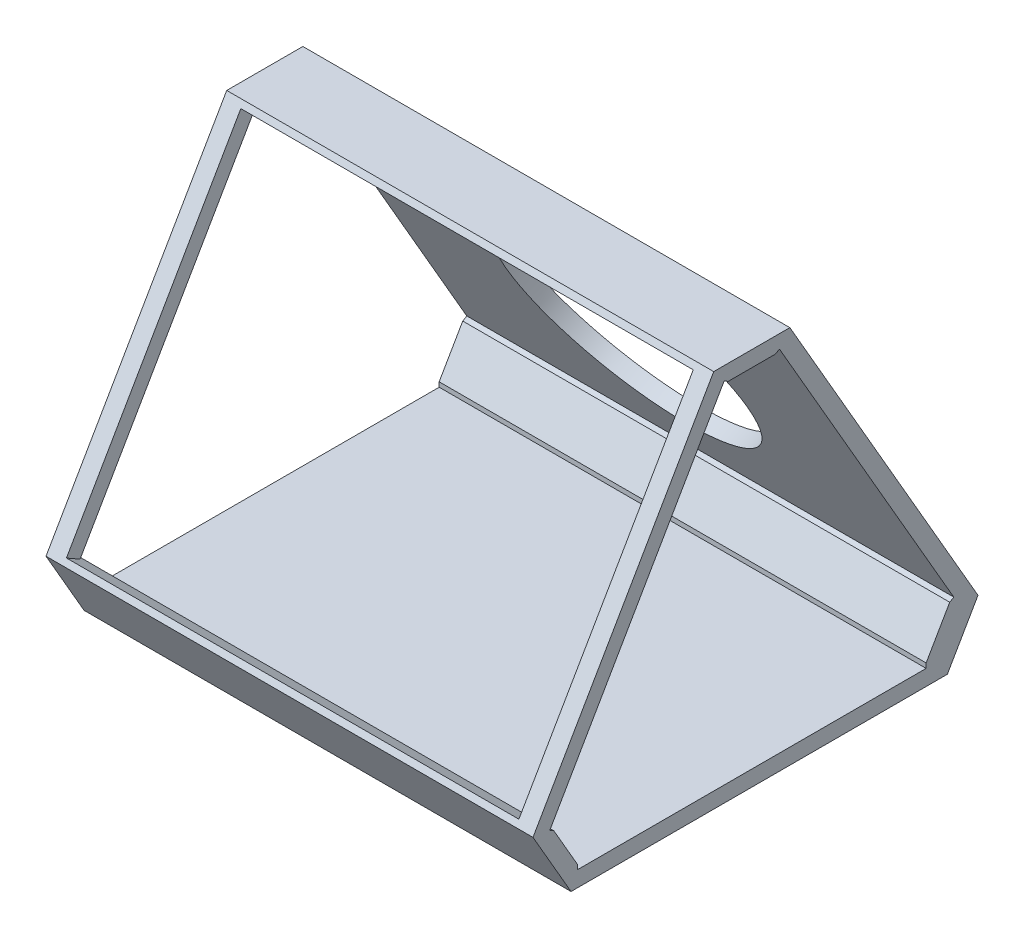
ISO-10303-21;
HEADER;
FILE_DESCRIPTION(('STEP AP214'),'2;1');
FILE_NAME('part.step','',(''),(''),'','','');
FILE_SCHEMA(('AUTOMOTIVE_DESIGN { 1 0 10303 214 1 1 1 1 }'));
ENDSEC;
DATA;
#1=APPLICATION_CONTEXT('core data for automotive mechanical design processes');
#2=APPLICATION_PROTOCOL_DEFINITION('international standard','automotive_design',2000,#1);
#3=PRODUCT_CONTEXT('',#1,'mechanical');
#4=PRODUCT('Part','Part','',(#3));
#5=PRODUCT_RELATED_PRODUCT_CATEGORY('part','',(#4));
#6=PRODUCT_DEFINITION_FORMATION('','',#4);
#7=PRODUCT_DEFINITION_CONTEXT('part definition',#1,'design');
#8=PRODUCT_DEFINITION('design','',#6,#7);
#9=PRODUCT_DEFINITION_SHAPE('','',#8);
#10=(LENGTH_UNIT() NAMED_UNIT(*) SI_UNIT(.MILLI.,.METRE.));
#11=(NAMED_UNIT(*) PLANE_ANGLE_UNIT() SI_UNIT($,.RADIAN.));
#12=(NAMED_UNIT(*) SI_UNIT($,.STERADIAN.) SOLID_ANGLE_UNIT());
#13=UNCERTAINTY_MEASURE_WITH_UNIT(LENGTH_MEASURE(1.E-05),#10,'distance_accuracy_value','');
#14=(GEOMETRIC_REPRESENTATION_CONTEXT(3) GLOBAL_UNCERTAINTY_ASSIGNED_CONTEXT((#13)) GLOBAL_UNIT_ASSIGNED_CONTEXT((#10,
#11,#12)) REPRESENTATION_CONTEXT('',''));
#15=CARTESIAN_POINT('',(0.,0.,0.));
#16=DIRECTION('',(0.,0.,1.));
#17=DIRECTION('',(1.,0.,0.));
#18=AXIS2_PLACEMENT_3D('',#15,#16,#17);
#19=CARTESIAN_POINT('',(155.,13.7403810567666,-6.20096189432337));
#20=DIRECTION('',(0.,-0.5,-0.866025403784439));
#21=DIRECTION('',(0.,0.866025403784439,-0.5));
#22=AXIS2_PLACEMENT_3D('',#19,#20,#21);
#23=PLANE('',#22);
#24=DIRECTION('',(0.,0.866025403784439,-0.5));
#25=VECTOR('',#24,1.);
#26=CARTESIAN_POINT('',(149.5,109.869200876839,-61.7009618943233));
#27=LINE('',#26,#25);
#28=CARTESIAN_POINT('',(149.5,13.7403810567665,-6.20096189432337));
#29=VERTEX_POINT('',#28);
#30=CARTESIAN_POINT('',(149.5,109.869200876839,-61.7009618943233));
#31=VERTEX_POINT('',#30);
#32=EDGE_CURVE('E183',#29,#31,#27,.T.);
#33=ORIENTED_EDGE('',*,*,#32,.T.);
#34=DIRECTION('',(-1.,0.,0.));
#35=VECTOR('',#34,1.);
#36=CARTESIAN_POINT('',(155.,109.869200876839,-61.7009618943233));
#37=LINE('',#36,#35);
#38=CARTESIAN_POINT('',(155.,109.869200876839,-61.7009618943233));
#39=VERTEX_POINT('',#38);
#40=EDGE_CURVE('E209',#39,#31,#37,.T.);
#41=ORIENTED_EDGE('',*,*,#40,.F.);
#42=DIRECTION('',(0.,-0.866025403784439,0.499999999999999));
#43=VECTOR('',#42,1.);
#44=CARTESIAN_POINT('',(155.,13.7403810567666,-6.20096189432337));
#45=LINE('',#44,#43);
#46=CARTESIAN_POINT('',(155.,13.7403810567666,-6.20096189432337));
#47=VERTEX_POINT('',#46);
#48=EDGE_CURVE('E205',#39,#47,#45,.T.);
#49=ORIENTED_EDGE('',*,*,#48,.T.);
#50=DIRECTION('',(-1.,0.,0.));
#51=VECTOR('',#50,1.);
#52=CARTESIAN_POINT('',(155.,13.7403810567666,-6.20096189432337));
#53=LINE('',#52,#51);
#54=EDGE_CURVE('E198',#47,#29,#53,.T.);
#55=ORIENTED_EDGE('',*,*,#54,.T.);
#56=EDGE_LOOP('',(#33,#41,#49,#55));
#57=FACE_BOUND('',#56,.T.);
#58=ADVANCED_FACE('F33',(#57),#23,.T.);
#59=CARTESIAN_POINT('',(155.,114.119200876839,-58.381197846483));
#60=DIRECTION('',(1.,0.,0.));
#61=DIRECTION('',(0.,0.,-1.));
#62=AXIS2_PLACEMENT_3D('',#59,#60,#61);
#63=PLANE('',#62);
#64=DIRECTION('',(0.,0.,1.));
#65=VECTOR('',#64,1.);
#66=CARTESIAN_POINT('',(155.,114.119200876839,-82.618802153517));
#67=LINE('',#66,#65);
#68=CARTESIAN_POINT('',(155.,114.119200876839,-82.618802153517));
#69=VERTEX_POINT('',#68);
#70=CARTESIAN_POINT('',(155.,114.119200876839,-58.381197846483));
#71=VERTEX_POINT('',#70);
#72=EDGE_CURVE('E237',#69,#71,#67,.T.);
#73=ORIENTED_EDGE('',*,*,#72,.T.);
#74=DIRECTION('',(0.,-0.866025403784439,0.5));
#75=VECTOR('',#74,1.);
#76=CARTESIAN_POINT('',(155.,114.119200876839,-58.381197846483));
#77=LINE('',#76,#75);
#78=CARTESIAN_POINT('',(155.,14.4903810567665,-0.86047190431933));
#79=VERTEX_POINT('',#78);
#80=EDGE_CURVE('E240',#71,#79,#77,.T.);
#81=ORIENTED_EDGE('',*,*,#80,.T.);
#82=DIRECTION('',(0.,-0.866025403784438,-0.5));
#83=VECTOR('',#82,1.);
#84=CARTESIAN_POINT('',(155.,14.4903810567665,-0.86047190431933));
#85=LINE('',#84,#83);
#86=CARTESIAN_POINT('',(155.,-6.5,-12.9792740578363));
#87=VERTEX_POINT('',#86);
#88=EDGE_CURVE('E243',#79,#87,#85,.T.);
#89=ORIENTED_EDGE('',*,*,#88,.T.);
#90=DIRECTION('',(0.,0.,-1.));
#91=VECTOR('',#90,1.);
#92=CARTESIAN_POINT('',(155.,-6.5,-12.9792740578363));
#93=LINE('',#92,#91);
#94=CARTESIAN_POINT('',(155.,-6.5,-132.75));
#95=VERTEX_POINT('',#94);
#96=EDGE_CURVE('E245',#87,#95,#93,.T.);
#97=ORIENTED_EDGE('',*,*,#96,.T.);
#98=DIRECTION('',(0.,0.866025403784439,-0.5));
#99=VECTOR('',#98,1.);
#100=CARTESIAN_POINT('',(155.,-6.5,-132.75));
#101=LINE('',#100,#99);
#102=CARTESIAN_POINT('',(155.,10.3947095812217,-142.504165124599));
#103=VERTEX_POINT('',#102);
#104=EDGE_CURVE('E247',#95,#103,#101,.T.);
#105=ORIENTED_EDGE('',*,*,#104,.T.);
#106=DIRECTION('',(0.,0.866025403784438,0.5));
#107=VECTOR('',#106,1.);
#108=CARTESIAN_POINT('',(155.,10.3947095812217,-142.504165124599));
#109=LINE('',#108,#107);
#110=EDGE_CURVE('E249',#103,#69,#109,.T.);
#111=ORIENTED_EDGE('',*,*,#110,.T.);
#112=EDGE_LOOP('',(#73,#81,#89,#97,#105,#111));
#113=FACE_BOUND('',#112,.T.);
#114=DIRECTION('',(0.,-0.866025403784439,-0.5));
#115=VECTOR('',#114,1.);
#116=CARTESIAN_POINT('',(155.,12.9903810567666,-7.49999999999999));
#117=LINE('',#116,#115);
#118=CARTESIAN_POINT('',(155.,12.9903810567666,-7.49999999999999));
#119=VERTEX_POINT('',#118);
#120=CARTESIAN_POINT('',(155.,0.,-15.));
#121=VERTEX_POINT('',#120);
#122=EDGE_CURVE('E356',#119,#121,#117,.T.);
#123=ORIENTED_EDGE('',*,*,#122,.F.);
#124=DIRECTION('',(0.,-0.499999999999999,-0.866025403784439));
#125=VECTOR('',#124,1.);
#126=CARTESIAN_POINT('',(155.,12.9903810567666,-7.49999999999999));
#127=LINE('',#126,#125);
#128=EDGE_CURVE('E355',#47,#119,#127,.T.);
#129=ORIENTED_EDGE('',*,*,#128,.F.);
#130=ORIENTED_EDGE('',*,*,#48,.F.);
#131=DIRECTION('',(0.,0.500000000000001,0.866025403784438));
#132=VECTOR('',#131,1.);
#133=CARTESIAN_POINT('',(155.,109.869200876839,-61.7009618943233));
#134=LINE('',#133,#132);
#135=CARTESIAN_POINT('',(155.,109.119200876839,-63.));
#136=VERTEX_POINT('',#135);
#137=EDGE_CURVE('E384',#136,#39,#134,.T.);
#138=ORIENTED_EDGE('',*,*,#137,.F.);
#139=DIRECTION('',(0.,0.,1.));
#140=VECTOR('',#139,1.);
#141=CARTESIAN_POINT('',(155.,109.119200876839,-63.));
#142=LINE('',#141,#140);
#143=CARTESIAN_POINT('',(155.,109.119200876839,-78.));
#144=VERTEX_POINT('',#143);
#145=EDGE_CURVE('E387',#144,#136,#142,.T.);
#146=ORIENTED_EDGE('',*,*,#145,.F.);
#147=DIRECTION('',(0.,-0.499999999999993,0.866025403784442));
#148=VECTOR('',#147,1.);
#149=CARTESIAN_POINT('',(155.,109.119200876839,-78.));
#150=LINE('',#149,#148);
#151=CARTESIAN_POINT('',(155.,109.869200876839,-79.2990381056767));
#152=VERTEX_POINT('',#151);
#153=EDGE_CURVE('E389',#152,#144,#150,.T.);
#154=ORIENTED_EDGE('',*,*,#153,.F.);
#155=DIRECTION('',(0.,0.866025403784439,0.499999999999999));
#156=VECTOR('',#155,1.);
#157=CARTESIAN_POINT('',(155.,109.869200876839,-79.2990381056767));
#158=LINE('',#157,#156);
#159=CARTESIAN_POINT('',(155.,13.7403810567666,-134.799038105677));
#160=VERTEX_POINT('',#159);
#161=EDGE_CURVE('E391',#160,#152,#158,.T.);
#162=ORIENTED_EDGE('',*,*,#161,.F.);
#163=DIRECTION('',(0.,0.500000000000008,-0.866025403784434));
#164=VECTOR('',#163,1.);
#165=CARTESIAN_POINT('',(155.,13.7403810567666,-134.799038105677));
#166=LINE('',#165,#164);
#167=CARTESIAN_POINT('',(155.,12.9903810567666,-133.5));
#168=VERTEX_POINT('',#167);
#169=EDGE_CURVE('E393',#168,#160,#166,.T.);
#170=ORIENTED_EDGE('',*,*,#169,.F.);
#171=DIRECTION('',(0.,0.866025403784438,-0.500000000000001));
#172=VECTOR('',#171,1.);
#173=CARTESIAN_POINT('',(155.,12.9903810567666,-133.5));
#174=LINE('',#173,#172);
#175=CARTESIAN_POINT('',(155.,0.,-126.));
#176=VERTEX_POINT('',#175);
#177=EDGE_CURVE('E395',#176,#168,#174,.T.);
#178=ORIENTED_EDGE('',*,*,#177,.F.);
#179=DIRECTION('',(0.,1.,0.));
#180=VECTOR('',#179,1.);
#181=CARTESIAN_POINT('',(155.,-1.5,-126.));
#182=LINE('',#181,#180);
#183=CARTESIAN_POINT('',(155.,-1.5,-126.));
#184=VERTEX_POINT('',#183);
#185=EDGE_CURVE('E397',#184,#176,#182,.T.);
#186=ORIENTED_EDGE('',*,*,#185,.F.);
#187=DIRECTION('',(0.,0.,-1.));
#188=VECTOR('',#187,1.);
#189=CARTESIAN_POINT('',(155.,-1.5,-15.));
#190=LINE('',#189,#188);
#191=CARTESIAN_POINT('',(155.,-1.5,-15.));
#192=VERTEX_POINT('',#191);
#193=EDGE_CURVE('E399',#192,#184,#190,.T.);
#194=ORIENTED_EDGE('',*,*,#193,.F.);
#195=DIRECTION('',(0.,-1.,0.));
#196=VECTOR('',#195,1.);
#197=CARTESIAN_POINT('',(155.,0.,-15.));
#198=LINE('',#197,#196);
#199=EDGE_CURVE('E401',#121,#192,#198,.T.);
#200=ORIENTED_EDGE('',*,*,#199,.F.);
#201=EDGE_LOOP('',(#123,#129,#130,#138,#146,#154,#162,#170,#178,#186,#194,#200));
#202=FACE_BOUND('',#201,.T.);
#203=ADVANCED_FACE('F299',(#113,#202),#63,.T.);
#204=CARTESIAN_POINT('',(0.,114.119200876839,-58.381197846483));
#205=DIRECTION('',(1.,0.,0.));
#206=DIRECTION('',(0.,0.,-1.));
#207=AXIS2_PLACEMENT_3D('',#204,#205,#206);
#208=PLANE('',#207);
#209=DIRECTION('',(0.,0.,1.));
#210=VECTOR('',#209,1.);
#211=CARTESIAN_POINT('',(0.,114.119200876839,-82.618802153517));
#212=LINE('',#211,#210);
#213=CARTESIAN_POINT('',(0.,114.119200876839,-82.618802153517));
#214=VERTEX_POINT('',#213);
#215=CARTESIAN_POINT('',(0.,114.119200876839,-58.381197846483));
#216=VERTEX_POINT('',#215);
#217=EDGE_CURVE('E236',#214,#216,#212,.T.);
#218=ORIENTED_EDGE('',*,*,#217,.F.);
#219=DIRECTION('',(0.,0.866025403784438,0.5));
#220=VECTOR('',#219,1.);
#221=CARTESIAN_POINT('',(0.,10.3947095812217,-142.504165124599));
#222=LINE('',#221,#220);
#223=CARTESIAN_POINT('',(0.,10.3947095812217,-142.504165124599));
#224=VERTEX_POINT('',#223);
#225=EDGE_CURVE('E241',#224,#214,#222,.T.);
#226=ORIENTED_EDGE('',*,*,#225,.F.);
#227=DIRECTION('',(0.,0.866025403784439,-0.5));
#228=VECTOR('',#227,1.);
#229=CARTESIAN_POINT('',(0.,-6.5,-132.75));
#230=LINE('',#229,#228);
#231=CARTESIAN_POINT('',(0.,-6.5,-132.75));
#232=VERTEX_POINT('',#231);
#233=EDGE_CURVE('E260',#232,#224,#230,.T.);
#234=ORIENTED_EDGE('',*,*,#233,.F.);
#235=DIRECTION('',(0.,0.,-1.));
#236=VECTOR('',#235,1.);
#237=CARTESIAN_POINT('',(0.,-6.5,-12.9792740578363));
#238=LINE('',#237,#236);
#239=CARTESIAN_POINT('',(0.,-6.5,-12.9792740578363));
#240=VERTEX_POINT('',#239);
#241=EDGE_CURVE('E258',#240,#232,#238,.T.);
#242=ORIENTED_EDGE('',*,*,#241,.F.);
#243=DIRECTION('',(0.,-0.866025403784438,-0.5));
#244=VECTOR('',#243,1.);
#245=CARTESIAN_POINT('',(0.,14.4903810567665,-0.86047190431933));
#246=LINE('',#245,#244);
#247=CARTESIAN_POINT('',(0.,14.4903810567665,-0.86047190431933));
#248=VERTEX_POINT('',#247);
#249=EDGE_CURVE('E256',#248,#240,#246,.T.);
#250=ORIENTED_EDGE('',*,*,#249,.F.);
#251=DIRECTION('',(0.,-0.866025403784439,0.5));
#252=VECTOR('',#251,1.);
#253=CARTESIAN_POINT('',(0.,114.119200876839,-58.381197846483));
#254=LINE('',#253,#252);
#255=EDGE_CURVE('E254',#216,#248,#254,.T.);
#256=ORIENTED_EDGE('',*,*,#255,.F.);
#257=EDGE_LOOP('',(#218,#226,#234,#242,#250,#256));
#258=FACE_BOUND('',#257,.T.);
#259=DIRECTION('',(0.,-0.499999999999999,-0.866025403784439));
#260=VECTOR('',#259,1.);
#261=CARTESIAN_POINT('',(0.,12.9903810567666,-7.49999999999999));
#262=LINE('',#261,#260);
#263=CARTESIAN_POINT('',(0.,13.7403810567666,-6.20096189432338));
#264=VERTEX_POINT('',#263);
#265=CARTESIAN_POINT('',(0.,12.9903810567666,-7.49999999999999));
#266=VERTEX_POINT('',#265);
#267=EDGE_CURVE('E345',#264,#266,#262,.T.);
#268=ORIENTED_EDGE('',*,*,#267,.T.);
#269=DIRECTION('',(0.,-0.866025403784439,-0.5));
#270=VECTOR('',#269,1.);
#271=CARTESIAN_POINT('',(0.,12.9903810567666,-7.49999999999999));
#272=LINE('',#271,#270);
#273=CARTESIAN_POINT('',(0.,0.,-15.));
#274=VERTEX_POINT('',#273);
#275=EDGE_CURVE('E349',#266,#274,#272,.T.);
#276=ORIENTED_EDGE('',*,*,#275,.T.);
#277=DIRECTION('',(0.,-1.,0.));
#278=VECTOR('',#277,1.);
#279=CARTESIAN_POINT('',(0.,0.,-15.));
#280=LINE('',#279,#278);
#281=CARTESIAN_POINT('',(0.,-1.5,-15.));
#282=VERTEX_POINT('',#281);
#283=EDGE_CURVE('E379',#274,#282,#280,.T.);
#284=ORIENTED_EDGE('',*,*,#283,.T.);
#285=DIRECTION('',(0.,0.,-1.));
#286=VECTOR('',#285,1.);
#287=CARTESIAN_POINT('',(0.,-1.5,-15.));
#288=LINE('',#287,#286);
#289=CARTESIAN_POINT('',(0.,-1.5,-126.));
#290=VERTEX_POINT('',#289);
#291=EDGE_CURVE('E376',#282,#290,#288,.T.);
#292=ORIENTED_EDGE('',*,*,#291,.T.);
#293=DIRECTION('',(0.,1.,0.));
#294=VECTOR('',#293,1.);
#295=CARTESIAN_POINT('',(0.,-1.5,-126.));
#296=LINE('',#295,#294);
#297=CARTESIAN_POINT('',(0.,0.,-126.));
#298=VERTEX_POINT('',#297);
#299=EDGE_CURVE('E373',#290,#298,#296,.T.);
#300=ORIENTED_EDGE('',*,*,#299,.T.);
#301=DIRECTION('',(0.,0.866025403784438,-0.500000000000001));
#302=VECTOR('',#301,1.);
#303=CARTESIAN_POINT('',(0.,12.9903810567666,-133.5));
#304=LINE('',#303,#302);
#305=CARTESIAN_POINT('',(0.,12.9903810567666,-133.5));
#306=VERTEX_POINT('',#305);
#307=EDGE_CURVE('E370',#298,#306,#304,.T.);
#308=ORIENTED_EDGE('',*,*,#307,.T.);
#309=DIRECTION('',(0.,0.500000000000008,-0.866025403784434));
#310=VECTOR('',#309,1.);
#311=CARTESIAN_POINT('',(0.,13.7403810567666,-134.799038105677));
#312=LINE('',#311,#310);
#313=CARTESIAN_POINT('',(0.,13.7403810567666,-134.799038105677));
#314=VERTEX_POINT('',#313);
#315=EDGE_CURVE('E367',#306,#314,#312,.T.);
#316=ORIENTED_EDGE('',*,*,#315,.T.);
#317=DIRECTION('',(0.,0.866025403784439,0.499999999999999));
#318=VECTOR('',#317,1.);
#319=CARTESIAN_POINT('',(0.,109.869200876839,-79.2990381056767));
#320=LINE('',#319,#318);
#321=CARTESIAN_POINT('',(0.,109.869200876839,-79.2990381056767));
#322=VERTEX_POINT('',#321);
#323=EDGE_CURVE('E364',#314,#322,#320,.T.);
#324=ORIENTED_EDGE('',*,*,#323,.T.);
#325=DIRECTION('',(0.,-0.499999999999993,0.866025403784442));
#326=VECTOR('',#325,1.);
#327=CARTESIAN_POINT('',(0.,109.119200876839,-78.));
#328=LINE('',#327,#326);
#329=CARTESIAN_POINT('',(0.,109.119200876839,-78.));
#330=VERTEX_POINT('',#329);
#331=EDGE_CURVE('E359',#322,#330,#328,.T.);
#332=ORIENTED_EDGE('',*,*,#331,.T.);
#333=DIRECTION('',(0.,0.,1.));
#334=VECTOR('',#333,1.);
#335=CARTESIAN_POINT('',(0.,109.119200876839,-63.));
#336=LINE('',#335,#334);
#337=CARTESIAN_POINT('',(0.,109.119200876839,-63.));
#338=VERTEX_POINT('',#337);
#339=EDGE_CURVE('E358',#330,#338,#336,.T.);
#340=ORIENTED_EDGE('',*,*,#339,.T.);
#341=DIRECTION('',(0.,0.500000000000001,0.866025403784438));
#342=VECTOR('',#341,1.);
#343=CARTESIAN_POINT('',(0.,109.869200876839,-61.7009618943233));
#344=LINE('',#343,#342);
#345=CARTESIAN_POINT('',(0.,109.869200876839,-61.7009618943233));
#346=VERTEX_POINT('',#345);
#347=EDGE_CURVE('E354',#338,#346,#344,.T.);
#348=ORIENTED_EDGE('',*,*,#347,.T.);
#349=DIRECTION('',(0.,-0.866025403784439,0.499999999999999));
#350=VECTOR('',#349,1.);
#351=CARTESIAN_POINT('',(0.,13.7403810567666,-6.20096189432337));
#352=LINE('',#351,#350);
#353=EDGE_CURVE('E212',#346,#264,#352,.T.);
#354=ORIENTED_EDGE('',*,*,#353,.T.);
#355=EDGE_LOOP('',(#268,#276,#284,#292,#300,#308,#316,#324,#332,#340,#348,#354));
#356=FACE_BOUND('',#355,.T.);
#357=ADVANCED_FACE('F285',(#258,#356),#208,.F.);
#358=CARTESIAN_POINT('',(155.,114.119200876839,-82.618802153517));
#359=DIRECTION('',(0.,-1.,0.));
#360=DIRECTION('',(0.,0.,-1.));
#361=AXIS2_PLACEMENT_3D('',#358,#359,#360);
#362=PLANE('',#361);
#363=ORIENTED_EDGE('',*,*,#217,.T.);
#364=DIRECTION('',(-1.,0.,0.));
#365=VECTOR('',#364,1.);
#366=CARTESIAN_POINT('',(155.,114.119200876839,-58.381197846483));
#367=LINE('',#366,#365);
#368=EDGE_CURVE('E11',#71,#216,#367,.T.);
#369=ORIENTED_EDGE('',*,*,#368,.F.);
#370=ORIENTED_EDGE('',*,*,#72,.F.);
#371=DIRECTION('',(-1.,0.,0.));
#372=VECTOR('',#371,1.);
#373=CARTESIAN_POINT('',(155.,114.119200876839,-82.618802153517));
#374=LINE('',#373,#372);
#375=EDGE_CURVE('E251',#69,#214,#374,.T.);
#376=ORIENTED_EDGE('',*,*,#375,.T.);
#377=EDGE_LOOP('',(#363,#369,#370,#376));
#378=FACE_BOUND('',#377,.T.);
#379=ADVANCED_FACE('F35',(#378),#362,.F.);
#380=CARTESIAN_POINT('',(155.,114.119200876839,-58.381197846483));
#381=DIRECTION('',(0.,-0.5,-0.866025403784439));
#382=DIRECTION('',(0.,0.866025403784439,-0.5));
#383=AXIS2_PLACEMENT_3D('',#380,#381,#382);
#384=PLANE('',#383);
#385=DIRECTION('',(0.,0.866025403784439,-0.499999999999999));
#386=VECTOR('',#385,1.);
#387=CARTESIAN_POINT('',(149.5,112.369200876839,-57.3708348754011));
#388=LINE('',#387,#386);
#389=CARTESIAN_POINT('',(149.5,16.2403810567665,-1.87083487540118));
#390=VERTEX_POINT('',#389);
#391=CARTESIAN_POINT('',(149.5,112.369200876839,-57.3708348754011));
#392=VERTEX_POINT('',#391);
#393=EDGE_CURVE('E410',#390,#392,#388,.T.);
#394=ORIENTED_EDGE('',*,*,#393,.F.);
#395=DIRECTION('',(1.,0.,0.));
#396=VECTOR('',#395,1.);
#397=CARTESIAN_POINT('',(5.50000000000001,16.2403810567665,-1.87083487540118));
#398=LINE('',#397,#396);
#399=CARTESIAN_POINT('',(5.50000000000001,16.2403810567665,-1.87083487540118));
#400=VERTEX_POINT('',#399);
#401=EDGE_CURVE('E201',#400,#390,#398,.T.);
#402=ORIENTED_EDGE('',*,*,#401,.F.);
#403=DIRECTION('',(0.,-0.866025403784439,0.499999999999999));
#404=VECTOR('',#403,1.);
#405=CARTESIAN_POINT('',(5.50000000000001,112.369200876839,-57.3708348754011));
#406=LINE('',#405,#404);
#407=CARTESIAN_POINT('',(5.50000000000001,112.369200876839,-57.3708348754012));
#408=VERTEX_POINT('',#407);
#409=EDGE_CURVE('E407',#408,#400,#406,.T.);
#410=ORIENTED_EDGE('',*,*,#409,.F.);
#411=DIRECTION('',(-1.,0.,0.));
#412=VECTOR('',#411,1.);
#413=CARTESIAN_POINT('',(5.50000000000001,112.369200876839,-57.3708348754011));
#414=LINE('',#413,#412);
#415=EDGE_CURVE('E49',#392,#408,#414,.T.);
#416=ORIENTED_EDGE('',*,*,#415,.F.);
#417=EDGE_LOOP('',(#394,#402,#410,#416));
#418=FACE_BOUND('',#417,.T.);
#419=ORIENTED_EDGE('',*,*,#255,.T.);
#420=DIRECTION('',(-1.,0.,0.));
#421=VECTOR('',#420,1.);
#422=CARTESIAN_POINT('',(155.,14.4903810567665,-0.86047190431933));
#423=LINE('',#422,#421);
#424=EDGE_CURVE('E42',#79,#248,#423,.T.);
#425=ORIENTED_EDGE('',*,*,#424,.F.);
#426=ORIENTED_EDGE('',*,*,#80,.F.);
#427=ORIENTED_EDGE('',*,*,#368,.T.);
#428=EDGE_LOOP('',(#419,#425,#426,#427));
#429=FACE_BOUND('',#428,.T.);
#430=ADVANCED_FACE('F304',(#418,#429),#384,.F.);
#431=CARTESIAN_POINT('',(155.,14.4903810567665,-0.86047190431933));
#432=DIRECTION('',(0.,0.5,-0.866025403784439));
#433=DIRECTION('',(0.,0.866025403784439,0.5));
#434=AXIS2_PLACEMENT_3D('',#431,#432,#433);
#435=PLANE('',#434);
#436=ORIENTED_EDGE('',*,*,#249,.T.);
#437=DIRECTION('',(-1.,0.,0.));
#438=VECTOR('',#437,1.);
#439=CARTESIAN_POINT('',(155.,-6.5,-12.9792740578363));
#440=LINE('',#439,#438);
#441=EDGE_CURVE('E271',#87,#240,#440,.T.);
#442=ORIENTED_EDGE('',*,*,#441,.F.);
#443=ORIENTED_EDGE('',*,*,#88,.F.);
#444=ORIENTED_EDGE('',*,*,#424,.T.);
#445=EDGE_LOOP('',(#436,#442,#443,#444));
#446=FACE_BOUND('',#445,.T.);
#447=ADVANCED_FACE('F279',(#446),#435,.F.);
#448=CARTESIAN_POINT('',(155.,-6.5,-12.9792740578363));
#449=DIRECTION('',(0.,1.,0.));
#450=DIRECTION('',(0.,0.,1.));
#451=AXIS2_PLACEMENT_3D('',#448,#449,#450);
#452=PLANE('',#451);
#453=ORIENTED_EDGE('',*,*,#241,.T.);
#454=DIRECTION('',(-1.,0.,0.));
#455=VECTOR('',#454,1.);
#456=CARTESIAN_POINT('',(155.,-6.5,-132.75));
#457=LINE('',#456,#455);
#458=EDGE_CURVE('E268',#95,#232,#457,.T.);
#459=ORIENTED_EDGE('',*,*,#458,.F.);
#460=ORIENTED_EDGE('',*,*,#96,.F.);
#461=ORIENTED_EDGE('',*,*,#441,.T.);
#462=EDGE_LOOP('',(#453,#459,#460,#461));
#463=FACE_BOUND('',#462,.T.);
#464=ADVANCED_FACE('F291',(#463),#452,.F.);
#465=CARTESIAN_POINT('',(155.,-6.5,-132.75));
#466=DIRECTION('',(0.,0.5,0.866025403784439));
#467=DIRECTION('',(0.,-0.866025403784439,0.5));
#468=AXIS2_PLACEMENT_3D('',#465,#466,#467);
#469=PLANE('',#468);
#470=ORIENTED_EDGE('',*,*,#233,.T.);
#471=DIRECTION('',(-1.,0.,0.));
#472=VECTOR('',#471,1.);
#473=CARTESIAN_POINT('',(155.,10.3947095812217,-142.504165124599));
#474=LINE('',#473,#472);
#475=EDGE_CURVE('E265',#103,#224,#474,.T.);
#476=ORIENTED_EDGE('',*,*,#475,.F.);
#477=ORIENTED_EDGE('',*,*,#104,.F.);
#478=ORIENTED_EDGE('',*,*,#458,.T.);
#479=EDGE_LOOP('',(#470,#476,#477,#478));
#480=FACE_BOUND('',#479,.T.);
#481=ADVANCED_FACE('F295',(#480),#469,.F.);
#482=CARTESIAN_POINT('',(155.,10.3947095812217,-142.504165124599));
#483=DIRECTION('',(0.,-0.5,0.866025403784438));
#484=DIRECTION('',(0.,-0.866025403784439,-0.5));
#485=AXIS2_PLACEMENT_3D('',#482,#483,#484);
#486=PLANE('',#485);
#487=CARTESIAN_POINT('',(77.5,62.2569552290305,-112.561483639058));
#488=DIRECTION('',(0.,0.500000000000001,-0.866025403784438));
#489=DIRECTION('',(0.,0.866025403784438,0.500000000000001));
#490=AXIS2_PLACEMENT_3D('',#487,#488,#489);
#491=CIRCLE('',#490,38.5);
#492=CARTESIAN_POINT('',(77.5,95.5989332747314,-93.3114836390579));
#493=VERTEX_POINT('',#492);
#494=EDGE_CURVE('E413',#493,#493,#491,.T.);
#495=ORIENTED_EDGE('',*,*,#494,.F.);
#496=EDGE_LOOP('',(#495));
#497=FACE_BOUND('',#496,.T.);
#498=ORIENTED_EDGE('',*,*,#225,.T.);
#499=ORIENTED_EDGE('',*,*,#375,.F.);
#500=ORIENTED_EDGE('',*,*,#110,.F.);
#501=ORIENTED_EDGE('',*,*,#475,.T.);
#502=EDGE_LOOP('',(#498,#499,#500,#501));
#503=FACE_BOUND('',#502,.T.);
#504=ADVANCED_FACE('F307',(#497,#503),#486,.F.);
#505=CARTESIAN_POINT('',(155.,12.9903810567666,-7.49999999999999));
#506=DIRECTION('',(0.,0.866025403784439,-0.499999999999999));
#507=DIRECTION('',(0.,0.499999999999999,0.866025403784439));
#508=AXIS2_PLACEMENT_3D('',#505,#506,#507);
#509=PLANE('',#508);
#510=ORIENTED_EDGE('',*,*,#267,.F.);
#511=CARTESIAN_POINT('',(5.50000000000001,13.7403810567666,-6.20096189432337));
#512=VERTEX_POINT('',#511);
#513=EDGE_CURVE('E207',#512,#264,#53,.T.);
#514=ORIENTED_EDGE('',*,*,#513,.F.);
#515=DIRECTION('',(0.,0.499999999999999,0.866025403784439));
#516=VECTOR('',#515,1.);
#517=CARTESIAN_POINT('',(5.50000000000001,-77.1675393902439,-163.658098918975));
#518=LINE('',#517,#516);
#519=EDGE_CURVE('E57',#512,#400,#518,.T.);
#520=ORIENTED_EDGE('',*,*,#519,.T.);
#521=ORIENTED_EDGE('',*,*,#401,.T.);
#522=DIRECTION('',(0.,0.499999999999999,0.866025403784439));
#523=VECTOR('',#522,1.);
#524=CARTESIAN_POINT('',(149.5,-77.1675393902439,-163.658098918975));
#525=LINE('',#524,#523);
#526=EDGE_CURVE('E187',#29,#390,#525,.T.);
#527=ORIENTED_EDGE('',*,*,#526,.F.);
#528=ORIENTED_EDGE('',*,*,#54,.F.);
#529=ORIENTED_EDGE('',*,*,#128,.T.);
#530=DIRECTION('',(-1.,0.,0.));
#531=VECTOR('',#530,1.);
#532=CARTESIAN_POINT('',(155.,12.9903810567666,-7.49999999999999));
#533=LINE('',#532,#531);
#534=EDGE_CURVE('E233',#119,#266,#533,.T.);
#535=ORIENTED_EDGE('',*,*,#534,.T.);
#536=EDGE_LOOP('',(#510,#514,#520,#521,#527,#528,#529,#535));
#537=FACE_BOUND('',#536,.T.);
#538=ADVANCED_FACE('F197',(#537),#509,.T.);
#539=CARTESIAN_POINT('',(155.,12.9903810567666,-7.49999999999999));
#540=DIRECTION('',(0.,0.5,-0.866025403784439));
#541=DIRECTION('',(0.,0.866025403784439,0.5));
#542=AXIS2_PLACEMENT_3D('',#539,#540,#541);
#543=PLANE('',#542);
#544=ORIENTED_EDGE('',*,*,#275,.F.);
#545=ORIENTED_EDGE('',*,*,#534,.F.);
#546=ORIENTED_EDGE('',*,*,#122,.T.);
#547=DIRECTION('',(-1.,0.,0.));
#548=VECTOR('',#547,1.);
#549=CARTESIAN_POINT('',(155.,0.,-15.));
#550=LINE('',#549,#548);
#551=EDGE_CURVE('E231',#121,#274,#550,.T.);
#552=ORIENTED_EDGE('',*,*,#551,.T.);
#553=EDGE_LOOP('',(#544,#545,#546,#552));
#554=FACE_BOUND('',#553,.T.);
#555=ADVANCED_FACE('F315',(#554),#543,.T.);
#556=CARTESIAN_POINT('',(155.,0.,-15.));
#557=DIRECTION('',(0.,0.,-1.));
#558=DIRECTION('',(-1.,0.,0.));
#559=AXIS2_PLACEMENT_3D('',#556,#557,#558);
#560=PLANE('',#559);
#561=ORIENTED_EDGE('',*,*,#283,.F.);
#562=ORIENTED_EDGE('',*,*,#551,.F.);
#563=ORIENTED_EDGE('',*,*,#199,.T.);
#564=DIRECTION('',(-1.,0.,0.));
#565=VECTOR('',#564,1.);
#566=CARTESIAN_POINT('',(155.,-1.5,-15.));
#567=LINE('',#566,#565);
#568=EDGE_CURVE('E229',#192,#282,#567,.T.);
#569=ORIENTED_EDGE('',*,*,#568,.T.);
#570=EDGE_LOOP('',(#561,#562,#563,#569));
#571=FACE_BOUND('',#570,.T.);
#572=ADVANCED_FACE('F476',(#571),#560,.T.);
#573=CARTESIAN_POINT('',(155.,-1.5,-15.));
#574=DIRECTION('',(0.,1.,0.));
#575=DIRECTION('',(0.,0.,1.));
#576=AXIS2_PLACEMENT_3D('',#573,#574,#575);
#577=PLANE('',#576);
#578=ORIENTED_EDGE('',*,*,#291,.F.);
#579=ORIENTED_EDGE('',*,*,#568,.F.);
#580=ORIENTED_EDGE('',*,*,#193,.T.);
#581=DIRECTION('',(-1.,0.,0.));
#582=VECTOR('',#581,1.);
#583=CARTESIAN_POINT('',(155.,-1.5,-126.));
#584=LINE('',#583,#582);
#585=EDGE_CURVE('E227',#184,#290,#584,.T.);
#586=ORIENTED_EDGE('',*,*,#585,.T.);
#587=EDGE_LOOP('',(#578,#579,#580,#586));
#588=FACE_BOUND('',#587,.T.);
#589=ADVANCED_FACE('F487',(#588),#577,.T.);
#590=CARTESIAN_POINT('',(155.,-1.5,-126.));
#591=DIRECTION('',(0.,0.,1.));
#592=DIRECTION('',(1.,0.,0.));
#593=AXIS2_PLACEMENT_3D('',#590,#591,#592);
#594=PLANE('',#593);
#595=ORIENTED_EDGE('',*,*,#299,.F.);
#596=ORIENTED_EDGE('',*,*,#585,.F.);
#597=ORIENTED_EDGE('',*,*,#185,.T.);
#598=DIRECTION('',(-1.,0.,0.));
#599=VECTOR('',#598,1.);
#600=CARTESIAN_POINT('',(155.,0.,-126.));
#601=LINE('',#600,#599);
#602=EDGE_CURVE('E225',#176,#298,#601,.T.);
#603=ORIENTED_EDGE('',*,*,#602,.T.);
#604=EDGE_LOOP('',(#595,#596,#597,#603));
#605=FACE_BOUND('',#604,.T.);
#606=ADVANCED_FACE('F497',(#605),#594,.T.);
#607=CARTESIAN_POINT('',(155.,12.9903810567666,-133.5));
#608=DIRECTION('',(0.,0.500000000000001,0.866025403784438));
#609=DIRECTION('',(0.,-0.866025403784438,0.500000000000001));
#610=AXIS2_PLACEMENT_3D('',#607,#608,#609);
#611=PLANE('',#610);
#612=ORIENTED_EDGE('',*,*,#307,.F.);
#613=ORIENTED_EDGE('',*,*,#602,.F.);
#614=ORIENTED_EDGE('',*,*,#177,.T.);
#615=DIRECTION('',(-1.,0.,0.));
#616=VECTOR('',#615,1.);
#617=CARTESIAN_POINT('',(155.,12.9903810567666,-133.5));
#618=LINE('',#617,#616);
#619=EDGE_CURVE('E223',#168,#306,#618,.T.);
#620=ORIENTED_EDGE('',*,*,#619,.T.);
#621=EDGE_LOOP('',(#612,#613,#614,#620));
#622=FACE_BOUND('',#621,.T.);
#623=ADVANCED_FACE('F507',(#622),#611,.T.);
#624=CARTESIAN_POINT('',(155.,13.7403810567666,-134.799038105677));
#625=DIRECTION('',(0.,0.866025403784434,0.500000000000008));
#626=DIRECTION('',(0.,-0.500000000000008,0.866025403784434));
#627=AXIS2_PLACEMENT_3D('',#624,#625,#626);
#628=PLANE('',#627);
#629=ORIENTED_EDGE('',*,*,#315,.F.);
#630=ORIENTED_EDGE('',*,*,#619,.F.);
#631=ORIENTED_EDGE('',*,*,#169,.T.);
#632=DIRECTION('',(-1.,0.,0.));
#633=VECTOR('',#632,1.);
#634=CARTESIAN_POINT('',(155.,13.7403810567666,-134.799038105677));
#635=LINE('',#634,#633);
#636=EDGE_CURVE('E221',#160,#314,#635,.T.);
#637=ORIENTED_EDGE('',*,*,#636,.T.);
#638=EDGE_LOOP('',(#629,#630,#631,#637));
#639=FACE_BOUND('',#638,.T.);
#640=ADVANCED_FACE('F425',(#639),#628,.T.);
#641=CARTESIAN_POINT('',(155.,109.869200876839,-79.2990381056767));
#642=DIRECTION('',(0.,-0.499999999999999,0.866025403784439));
#643=DIRECTION('',(0.,-0.866025403784439,-0.499999999999999));
#644=AXIS2_PLACEMENT_3D('',#641,#642,#643);
#645=PLANE('',#644);
#646=CARTESIAN_POINT('',(77.5,59.7569552290305,-108.231356620136));
#647=DIRECTION('',(0.,-0.499999999999999,0.866025403784439));
#648=DIRECTION('',(0.,-0.866025403784439,-0.499999999999999));
#649=AXIS2_PLACEMENT_3D('',#646,#647,#648);
#650=CIRCLE('',#649,38.5);
#651=CARTESIAN_POINT('',(77.5,26.4149771833296,-127.481356620136));
#652=VERTEX_POINT('',#651);
#653=EDGE_CURVE('E37',#652,#652,#650,.T.);
#654=ORIENTED_EDGE('',*,*,#653,.F.);
#655=EDGE_LOOP('',(#654));
#656=FACE_BOUND('',#655,.T.);
#657=ORIENTED_EDGE('',*,*,#323,.F.);
#658=ORIENTED_EDGE('',*,*,#636,.F.);
#659=ORIENTED_EDGE('',*,*,#161,.T.);
#660=DIRECTION('',(-1.,0.,0.));
#661=VECTOR('',#660,1.);
#662=CARTESIAN_POINT('',(155.,109.869200876839,-79.2990381056767));
#663=LINE('',#662,#661);
#664=EDGE_CURVE('E219',#152,#322,#663,.T.);
#665=ORIENTED_EDGE('',*,*,#664,.T.);
#666=EDGE_LOOP('',(#657,#658,#659,#665));
#667=FACE_BOUND('',#666,.T.);
#668=ADVANCED_FACE('F421',(#656,#667),#645,.T.);
#669=CARTESIAN_POINT('',(155.,109.119200876839,-78.));
#670=DIRECTION('',(0.,-0.866025403784442,-0.499999999999994));
#671=DIRECTION('',(0.,0.499999999999994,-0.866025403784442));
#672=AXIS2_PLACEMENT_3D('',#669,#670,#671);
#673=PLANE('',#672);
#674=ORIENTED_EDGE('',*,*,#331,.F.);
#675=ORIENTED_EDGE('',*,*,#664,.F.);
#676=ORIENTED_EDGE('',*,*,#153,.T.);
#677=DIRECTION('',(-1.,0.,0.));
#678=VECTOR('',#677,1.);
#679=CARTESIAN_POINT('',(155.,109.119200876839,-78.));
#680=LINE('',#679,#678);
#681=EDGE_CURVE('E217',#144,#330,#680,.T.);
#682=ORIENTED_EDGE('',*,*,#681,.T.);
#683=EDGE_LOOP('',(#674,#675,#676,#682));
#684=FACE_BOUND('',#683,.T.);
#685=ADVANCED_FACE('F424',(#684),#673,.T.);
#686=CARTESIAN_POINT('',(155.,109.119200876839,-63.));
#687=DIRECTION('',(0.,-1.,0.));
#688=DIRECTION('',(0.,0.,-1.));
#689=AXIS2_PLACEMENT_3D('',#686,#687,#688);
#690=PLANE('',#689);
#691=ORIENTED_EDGE('',*,*,#339,.F.);
#692=ORIENTED_EDGE('',*,*,#681,.F.);
#693=ORIENTED_EDGE('',*,*,#145,.T.);
#694=DIRECTION('',(-1.,0.,0.));
#695=VECTOR('',#694,1.);
#696=CARTESIAN_POINT('',(155.,109.119200876839,-63.));
#697=LINE('',#696,#695);
#698=EDGE_CURVE('E215',#136,#338,#697,.T.);
#699=ORIENTED_EDGE('',*,*,#698,.T.);
#700=EDGE_LOOP('',(#691,#692,#693,#699));
#701=FACE_BOUND('',#700,.T.);
#702=ADVANCED_FACE('F337',(#701),#690,.T.);
#703=CARTESIAN_POINT('',(155.,109.869200876839,-61.7009618943233));
#704=DIRECTION('',(0.,-0.866025403784438,0.500000000000001));
#705=DIRECTION('',(0.,-0.500000000000001,-0.866025403784438));
#706=AXIS2_PLACEMENT_3D('',#703,#704,#705);
#707=PLANE('',#706);
#708=ORIENTED_EDGE('',*,*,#347,.F.);
#709=ORIENTED_EDGE('',*,*,#698,.F.);
#710=ORIENTED_EDGE('',*,*,#137,.T.);
#711=ORIENTED_EDGE('',*,*,#40,.T.);
#712=DIRECTION('',(0.,0.499999999999999,0.866025403784439));
#713=VECTOR('',#712,1.);
#714=CARTESIAN_POINT('',(149.5,18.9612804298289,-219.158098918975));
#715=LINE('',#714,#713);
#716=EDGE_CURVE('E189',#31,#392,#715,.T.);
#717=ORIENTED_EDGE('',*,*,#716,.T.);
#718=ORIENTED_EDGE('',*,*,#415,.T.);
#719=DIRECTION('',(0.,0.499999999999999,0.866025403784439));
#720=VECTOR('',#719,1.);
#721=CARTESIAN_POINT('',(5.50000000000001,18.9612804298289,-219.158098918975));
#722=LINE('',#721,#720);
#723=CARTESIAN_POINT('',(5.50000000000001,109.869200876839,-61.7009618943233));
#724=VERTEX_POINT('',#723);
#725=EDGE_CURVE('E342',#724,#408,#722,.T.);
#726=ORIENTED_EDGE('',*,*,#725,.F.);
#727=EDGE_CURVE('E206',#724,#346,#37,.T.);
#728=ORIENTED_EDGE('',*,*,#727,.T.);
#729=EDGE_LOOP('',(#708,#709,#710,#711,#717,#718,#726,#728));
#730=FACE_BOUND('',#729,.T.);
#731=ADVANCED_FACE('F330',(#730),#707,.T.);
#732=DIRECTION('',(0.,-0.866025403784439,0.5));
#733=VECTOR('',#732,1.);
#734=CARTESIAN_POINT('',(5.50000000000001,109.869200876839,-61.7009618943233));
#735=LINE('',#734,#733);
#736=EDGE_CURVE('E339',#724,#512,#735,.T.);
#737=ORIENTED_EDGE('',*,*,#736,.T.);
#738=ORIENTED_EDGE('',*,*,#513,.T.);
#739=ORIENTED_EDGE('',*,*,#353,.F.);
#740=ORIENTED_EDGE('',*,*,#727,.F.);
#741=EDGE_LOOP('',(#737,#738,#739,#740));
#742=FACE_BOUND('',#741,.T.);
#743=ADVANCED_FACE('F322',(#742),#23,.T.);
#744=CARTESIAN_POINT('',(149.5,18.9612804298289,-219.158098918975));
#745=DIRECTION('',(1.,0.,0.));
#746=DIRECTION('',(0.,0.,-1.));
#747=AXIS2_PLACEMENT_3D('',#744,#745,#746);
#748=PLANE('',#747);
#749=ORIENTED_EDGE('',*,*,#526,.T.);
#750=ORIENTED_EDGE('',*,*,#393,.T.);
#751=ORIENTED_EDGE('',*,*,#716,.F.);
#752=ORIENTED_EDGE('',*,*,#32,.F.);
#753=EDGE_LOOP('',(#749,#750,#751,#752));
#754=FACE_BOUND('',#753,.T.);
#755=ADVANCED_FACE('F185',(#754),#748,.F.);
#756=CARTESIAN_POINT('',(5.50000000000001,18.9612804298289,-219.158098918975));
#757=DIRECTION('',(-1.,0.,0.));
#758=DIRECTION('',(0.,0.,1.));
#759=AXIS2_PLACEMENT_3D('',#756,#757,#758);
#760=PLANE('',#759);
#761=ORIENTED_EDGE('',*,*,#725,.T.);
#762=ORIENTED_EDGE('',*,*,#409,.T.);
#763=ORIENTED_EDGE('',*,*,#519,.F.);
#764=ORIENTED_EDGE('',*,*,#736,.F.);
#765=EDGE_LOOP('',(#761,#762,#763,#764));
#766=FACE_BOUND('',#765,.T.);
#767=ADVANCED_FACE('F336',(#766),#760,.F.);
#768=CARTESIAN_POINT('',(77.5,57.2569552290305,-103.901229601214));
#769=DIRECTION('',(0.,0.500000000000001,-0.866025403784438));
#770=DIRECTION('',(0.,0.866025403784438,0.500000000000001));
#771=AXIS2_PLACEMENT_3D('',#768,#769,#770);
#772=CYLINDRICAL_SURFACE('',#771,38.5);
#773=ORIENTED_EDGE('',*,*,#653,.T.);
#774=EDGE_LOOP('',(#773));
#775=FACE_BOUND('',#774,.T.);
#776=ORIENTED_EDGE('',*,*,#494,.T.);
#777=EDGE_LOOP('',(#776));
#778=FACE_BOUND('',#777,.T.);
#779=ADVANCED_FACE('F419',(#775,#778),#772,.F.);
#780=CLOSED_SHELL('',(#58,#203,#357,#379,#430,#447,#464,#481,#504,#538,#555,#572,#589,#606,#623,
#640,#668,#685,#702,#731,#743,#755,#767,#779));
#781=MANIFOLD_SOLID_BREP('B2',#780);
#782=ADVANCED_BREP_SHAPE_REPRESENTATION('',(#18,#781),#14);
#783=SHAPE_DEFINITION_REPRESENTATION(#9,#782);
ENDSEC;
END-ISO-10303-21;
